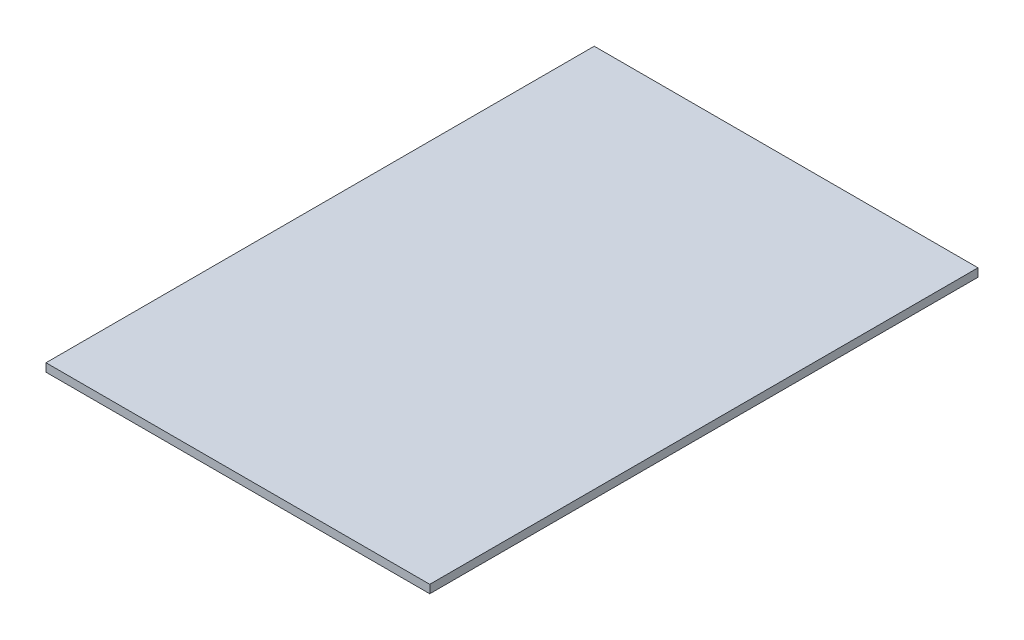
ISO-10303-21;
HEADER;
FILE_DESCRIPTION(('STEP AP214'),'2;1');
FILE_NAME('part.step','',(''),(''),'','','');
FILE_SCHEMA(('AUTOMOTIVE_DESIGN { 1 0 10303 214 1 1 1 1 }'));
ENDSEC;
DATA;
#1=APPLICATION_CONTEXT('core data for automotive mechanical design processes');
#2=APPLICATION_PROTOCOL_DEFINITION('international standard','automotive_design',2000,#1);
#3=PRODUCT_CONTEXT('',#1,'mechanical');
#4=PRODUCT('Part','Part','',(#3));
#5=PRODUCT_RELATED_PRODUCT_CATEGORY('part','',(#4));
#6=PRODUCT_DEFINITION_FORMATION('','',#4);
#7=PRODUCT_DEFINITION_CONTEXT('part definition',#1,'design');
#8=PRODUCT_DEFINITION('design','',#6,#7);
#9=PRODUCT_DEFINITION_SHAPE('','',#8);
#10=(LENGTH_UNIT() NAMED_UNIT(*) SI_UNIT(.MILLI.,.METRE.));
#11=(NAMED_UNIT(*) PLANE_ANGLE_UNIT() SI_UNIT($,.RADIAN.));
#12=(NAMED_UNIT(*) SI_UNIT($,.STERADIAN.) SOLID_ANGLE_UNIT());
#13=UNCERTAINTY_MEASURE_WITH_UNIT(LENGTH_MEASURE(1.E-05),#10,'distance_accuracy_value','');
#14=(GEOMETRIC_REPRESENTATION_CONTEXT(3) GLOBAL_UNCERTAINTY_ASSIGNED_CONTEXT((#13)) GLOBAL_UNIT_ASSIGNED_CONTEXT((#10,
#11,#12)) REPRESENTATION_CONTEXT('',''));
#15=CARTESIAN_POINT('',(0.,0.,0.));
#16=DIRECTION('',(0.,0.,1.));
#17=DIRECTION('',(1.,0.,0.));
#18=AXIS2_PLACEMENT_3D('',#15,#16,#17);
#19=CARTESIAN_POINT('',(0.,0.,0.));
#20=DIRECTION('',(0.,1.,0.));
#21=DIRECTION('',(1.,0.,0.));
#22=AXIS2_PLACEMENT_3D('',#19,#20,#21);
#23=PLANE('',#22);
#24=DIRECTION('',(0.,0.,-1.));
#25=VECTOR('',#24,1.);
#26=CARTESIAN_POINT('',(70.,0.,100.));
#27=LINE('',#26,#25);
#28=CARTESIAN_POINT('',(70.,0.,100.));
#29=VERTEX_POINT('',#28);
#30=CARTESIAN_POINT('',(70.,0.,-100.));
#31=VERTEX_POINT('',#30);
#32=EDGE_CURVE('E20',#29,#31,#27,.T.);
#33=ORIENTED_EDGE('',*,*,#32,.F.);
#34=DIRECTION('',(1.,0.,0.));
#35=VECTOR('',#34,1.);
#36=CARTESIAN_POINT('',(-70.,0.,100.));
#37=LINE('',#36,#35);
#38=CARTESIAN_POINT('',(-70.,0.,100.));
#39=VERTEX_POINT('',#38);
#40=EDGE_CURVE('E90',#39,#29,#37,.T.);
#41=ORIENTED_EDGE('',*,*,#40,.F.);
#42=DIRECTION('',(0.,0.,1.));
#43=VECTOR('',#42,1.);
#44=CARTESIAN_POINT('',(-70.,0.,-100.));
#45=LINE('',#44,#43);
#46=CARTESIAN_POINT('',(-70.,0.,-100.));
#47=VERTEX_POINT('',#46);
#48=EDGE_CURVE('E75',#47,#39,#45,.T.);
#49=ORIENTED_EDGE('',*,*,#48,.F.);
#50=DIRECTION('',(-1.,0.,0.));
#51=VECTOR('',#50,1.);
#52=CARTESIAN_POINT('',(70.,0.,-100.));
#53=LINE('',#52,#51);
#54=EDGE_CURVE('E107',#31,#47,#53,.T.);
#55=ORIENTED_EDGE('',*,*,#54,.F.);
#56=EDGE_LOOP('',(#33,#41,#49,#55));
#57=FACE_BOUND('',#56,.T.);
#58=ADVANCED_FACE('F17',(#57),#23,.F.);
#59=CARTESIAN_POINT('',(0.,3.,0.));
#60=DIRECTION('',(0.,1.,0.));
#61=DIRECTION('',(1.,0.,0.));
#62=AXIS2_PLACEMENT_3D('',#59,#60,#61);
#63=PLANE('',#62);
#64=DIRECTION('',(0.,0.,-1.));
#65=VECTOR('',#64,1.);
#66=CARTESIAN_POINT('',(70.,3.,100.));
#67=LINE('',#66,#65);
#68=CARTESIAN_POINT('',(70.,3.,100.));
#69=VERTEX_POINT('',#68);
#70=CARTESIAN_POINT('',(70.,3.,-100.));
#71=VERTEX_POINT('',#70);
#72=EDGE_CURVE('E11',#69,#71,#67,.T.);
#73=ORIENTED_EDGE('',*,*,#72,.T.);
#74=DIRECTION('',(-1.,0.,0.));
#75=VECTOR('',#74,1.);
#76=CARTESIAN_POINT('',(70.,3.,-100.));
#77=LINE('',#76,#75);
#78=CARTESIAN_POINT('',(-70.,3.,-100.));
#79=VERTEX_POINT('',#78);
#80=EDGE_CURVE('E112',#71,#79,#77,.T.);
#81=ORIENTED_EDGE('',*,*,#80,.T.);
#82=DIRECTION('',(0.,0.,1.));
#83=VECTOR('',#82,1.);
#84=CARTESIAN_POINT('',(-70.,3.,-100.));
#85=LINE('',#84,#83);
#86=CARTESIAN_POINT('',(-70.,3.,100.));
#87=VERTEX_POINT('',#86);
#88=EDGE_CURVE('E83',#79,#87,#85,.T.);
#89=ORIENTED_EDGE('',*,*,#88,.T.);
#90=DIRECTION('',(1.,0.,0.));
#91=VECTOR('',#90,1.);
#92=CARTESIAN_POINT('',(-70.,3.,100.));
#93=LINE('',#92,#91);
#94=EDGE_CURVE('E89',#87,#69,#93,.T.);
#95=ORIENTED_EDGE('',*,*,#94,.T.);
#96=EDGE_LOOP('',(#73,#81,#89,#95));
#97=FACE_BOUND('',#96,.T.);
#98=ADVANCED_FACE('F132',(#97),#63,.T.);
#99=CARTESIAN_POINT('',(70.,0.,100.));
#100=DIRECTION('',(1.,0.,0.));
#101=DIRECTION('',(0.,1.,0.));
#102=AXIS2_PLACEMENT_3D('',#99,#100,#101);
#103=PLANE('',#102);
#104=ORIENTED_EDGE('',*,*,#32,.T.);
#105=DIRECTION('',(0.,1.,0.));
#106=VECTOR('',#105,1.);
#107=CARTESIAN_POINT('',(70.,0.,-100.));
#108=LINE('',#107,#106);
#109=EDGE_CURVE('E114',#31,#71,#108,.T.);
#110=ORIENTED_EDGE('',*,*,#109,.T.);
#111=ORIENTED_EDGE('',*,*,#72,.F.);
#112=DIRECTION('',(0.,1.,0.));
#113=VECTOR('',#112,1.);
#114=CARTESIAN_POINT('',(70.,0.,100.));
#115=LINE('',#114,#113);
#116=EDGE_CURVE('E94',#29,#69,#115,.T.);
#117=ORIENTED_EDGE('',*,*,#116,.F.);
#118=EDGE_LOOP('',(#104,#110,#111,#117));
#119=FACE_BOUND('',#118,.T.);
#120=ADVANCED_FACE('F139',(#119),#103,.T.);
#121=CARTESIAN_POINT('',(70.,0.,-100.));
#122=DIRECTION('',(0.,0.,-1.));
#123=DIRECTION('',(0.,-1.,0.));
#124=AXIS2_PLACEMENT_3D('',#121,#122,#123);
#125=PLANE('',#124);
#126=ORIENTED_EDGE('',*,*,#54,.T.);
#127=DIRECTION('',(0.,1.,0.));
#128=VECTOR('',#127,1.);
#129=CARTESIAN_POINT('',(-70.,0.,-100.));
#130=LINE('',#129,#128);
#131=EDGE_CURVE('E77',#47,#79,#130,.T.);
#132=ORIENTED_EDGE('',*,*,#131,.T.);
#133=ORIENTED_EDGE('',*,*,#80,.F.);
#134=ORIENTED_EDGE('',*,*,#109,.F.);
#135=EDGE_LOOP('',(#126,#132,#133,#134));
#136=FACE_BOUND('',#135,.T.);
#137=ADVANCED_FACE('F150',(#136),#125,.T.);
#138=CARTESIAN_POINT('',(-70.,0.,-100.));
#139=DIRECTION('',(-1.,0.,0.));
#140=DIRECTION('',(0.,1.,0.));
#141=AXIS2_PLACEMENT_3D('',#138,#139,#140);
#142=PLANE('',#141);
#143=ORIENTED_EDGE('',*,*,#48,.T.);
#144=DIRECTION('',(0.,1.,0.));
#145=VECTOR('',#144,1.);
#146=CARTESIAN_POINT('',(-70.,0.,100.));
#147=LINE('',#146,#145);
#148=EDGE_CURVE('E74',#39,#87,#147,.T.);
#149=ORIENTED_EDGE('',*,*,#148,.T.);
#150=ORIENTED_EDGE('',*,*,#88,.F.);
#151=ORIENTED_EDGE('',*,*,#131,.F.);
#152=EDGE_LOOP('',(#143,#149,#150,#151));
#153=FACE_BOUND('',#152,.T.);
#154=ADVANCED_FACE('F73',(#153),#142,.T.);
#155=CARTESIAN_POINT('',(-70.,0.,100.));
#156=DIRECTION('',(0.,0.,1.));
#157=DIRECTION('',(1.,0.,0.));
#158=AXIS2_PLACEMENT_3D('',#155,#156,#157);
#159=PLANE('',#158);
#160=ORIENTED_EDGE('',*,*,#40,.T.);
#161=ORIENTED_EDGE('',*,*,#116,.T.);
#162=ORIENTED_EDGE('',*,*,#94,.F.);
#163=ORIENTED_EDGE('',*,*,#148,.F.);
#164=EDGE_LOOP('',(#160,#161,#162,#163));
#165=FACE_BOUND('',#164,.T.);
#166=ADVANCED_FACE('F87',(#165),#159,.T.);
#167=CLOSED_SHELL('',(#58,#98,#120,#137,#154,#166));
#168=MANIFOLD_SOLID_BREP('B1',#167);
#169=ADVANCED_BREP_SHAPE_REPRESENTATION('',(#18,#168),#14);
#170=SHAPE_DEFINITION_REPRESENTATION(#9,#169);
ENDSEC;
END-ISO-10303-21;
